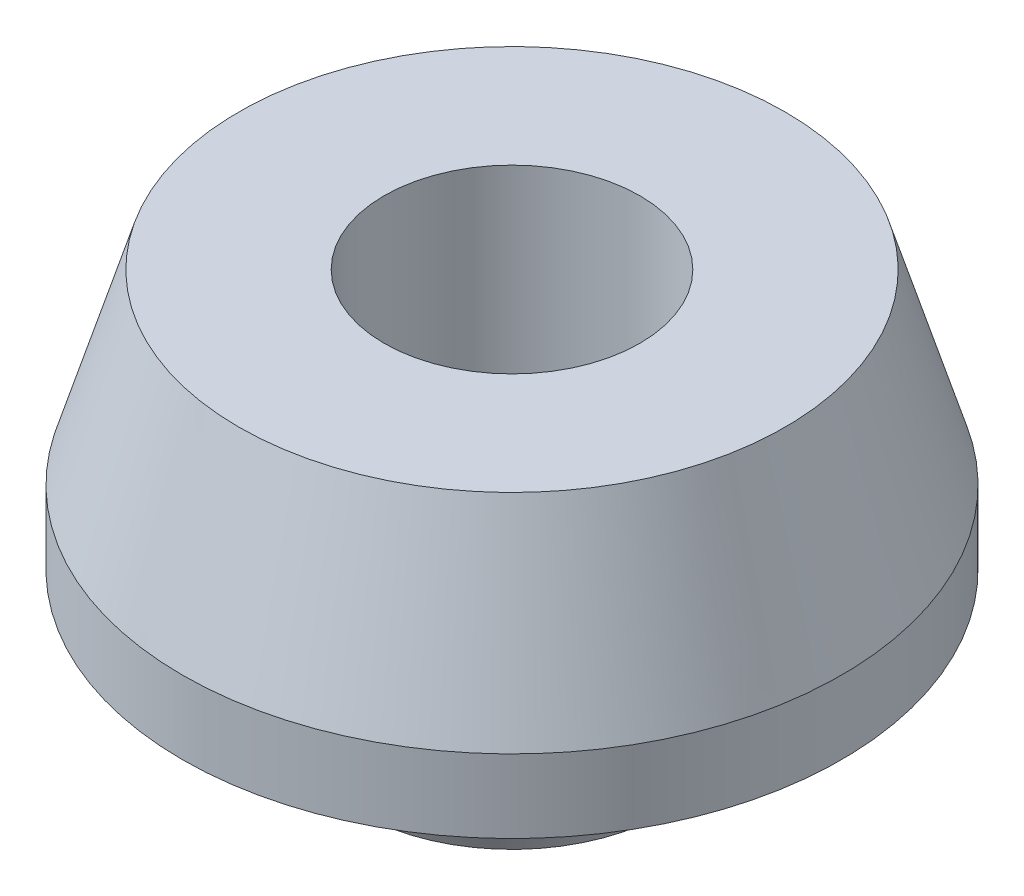
ISO-10303-21;
HEADER;
FILE_DESCRIPTION(('STEP AP214'),'2;1');
FILE_NAME('part.step','',(''),(''),'','','');
FILE_SCHEMA(('AUTOMOTIVE_DESIGN { 1 0 10303 214 1 1 1 1 }'));
ENDSEC;
DATA;
#1=APPLICATION_CONTEXT('core data for automotive mechanical design processes');
#2=APPLICATION_PROTOCOL_DEFINITION('international standard','automotive_design',2000,#1);
#3=PRODUCT_CONTEXT('',#1,'mechanical');
#4=PRODUCT('Part','Part','',(#3));
#5=PRODUCT_RELATED_PRODUCT_CATEGORY('part','',(#4));
#6=PRODUCT_DEFINITION_FORMATION('','',#4);
#7=PRODUCT_DEFINITION_CONTEXT('part definition',#1,'design');
#8=PRODUCT_DEFINITION('design','',#6,#7);
#9=PRODUCT_DEFINITION_SHAPE('','',#8);
#10=(LENGTH_UNIT() NAMED_UNIT(*) SI_UNIT(.MILLI.,.METRE.));
#11=(NAMED_UNIT(*) PLANE_ANGLE_UNIT() SI_UNIT($,.RADIAN.));
#12=(NAMED_UNIT(*) SI_UNIT($,.STERADIAN.) SOLID_ANGLE_UNIT());
#13=UNCERTAINTY_MEASURE_WITH_UNIT(LENGTH_MEASURE(1.E-05),#10,'distance_accuracy_value','');
#14=(GEOMETRIC_REPRESENTATION_CONTEXT(3) GLOBAL_UNCERTAINTY_ASSIGNED_CONTEXT((#13)) GLOBAL_UNIT_ASSIGNED_CONTEXT((#10,
#11,#12)) REPRESENTATION_CONTEXT('',''));
#15=CARTESIAN_POINT('',(0.,0.,0.));
#16=DIRECTION('',(0.,0.,1.));
#17=DIRECTION('',(1.,0.,0.));
#18=AXIS2_PLACEMENT_3D('',#15,#16,#17);
#19=CARTESIAN_POINT('',(0.,17.8514449626196,0.));
#20=DIRECTION('',(0.,1.,0.));
#21=DIRECTION('',(0.,0.,1.));
#22=AXIS2_PLACEMENT_3D('',#19,#20,#21);
#23=CYLINDRICAL_SURFACE('',#22,4.8);
#24=CARTESIAN_POINT('',(0.,0.,0.));
#25=DIRECTION('',(0.,1.,0.));
#26=DIRECTION('',(0.,0.,1.));
#27=AXIS2_PLACEMENT_3D('',#24,#25,#26);
#28=CIRCLE('',#27,4.8);
#29=CARTESIAN_POINT('',(0.,0.,4.8));
#30=VERTEX_POINT('',#29);
#31=EDGE_CURVE('E10',#30,#30,#28,.T.);
#32=ORIENTED_EDGE('',*,*,#31,.F.);
#33=EDGE_LOOP('',(#32));
#34=FACE_BOUND('',#33,.T.);
#35=CARTESIAN_POINT('',(0.,14.75,0.));
#36=DIRECTION('',(0.,1.,0.));
#37=DIRECTION('',(0.,0.,1.));
#38=AXIS2_PLACEMENT_3D('',#35,#36,#37);
#39=CIRCLE('',#38,4.8);
#40=CARTESIAN_POINT('',(0.,14.75,4.8));
#41=VERTEX_POINT('',#40);
#42=EDGE_CURVE('E57',#41,#41,#39,.T.);
#43=ORIENTED_EDGE('',*,*,#42,.T.);
#44=EDGE_LOOP('',(#43));
#45=FACE_BOUND('',#44,.T.);
#46=ADVANCED_FACE('F32',(#34,#45),#23,.F.);
#47=CARTESIAN_POINT('',(4.8,0.,0.));
#48=DIRECTION('',(0.,1.,0.));
#49=DIRECTION('',(0.,0.,1.));
#50=AXIS2_PLACEMENT_3D('',#47,#48,#49);
#51=PLANE('',#50);
#52=CARTESIAN_POINT('',(0.,0.,0.));
#53=DIRECTION('',(0.,1.,0.));
#54=DIRECTION('',(0.,0.,1.));
#55=AXIS2_PLACEMENT_3D('',#52,#53,#54);
#56=CIRCLE('',#55,5.8);
#57=CARTESIAN_POINT('',(0.,0.,5.8));
#58=VERTEX_POINT('',#57);
#59=EDGE_CURVE('E38',#58,#58,#56,.T.);
#60=ORIENTED_EDGE('',*,*,#59,.F.);
#61=EDGE_LOOP('',(#60));
#62=FACE_BOUND('',#61,.T.);
#63=ORIENTED_EDGE('',*,*,#31,.T.);
#64=EDGE_LOOP('',(#63));
#65=FACE_BOUND('',#64,.T.);
#66=ADVANCED_FACE('F88',(#62,#65),#51,.F.);
#67=CARTESIAN_POINT('',(0.,0.,0.));
#68=DIRECTION('',(0.,1.,0.));
#69=DIRECTION('',(0.,0.,1.));
#70=AXIS2_PLACEMENT_3D('',#67,#68,#69);
#71=CONICAL_SURFACE('',#70,5.8,0.349065850398863);
#72=CARTESIAN_POINT('',(0.,5.,0.));
#73=DIRECTION('',(0.,1.,0.));
#74=DIRECTION('',(0.,0.,1.));
#75=AXIS2_PLACEMENT_3D('',#72,#73,#74);
#76=CIRCLE('',#75,7.61985117133099);
#77=CARTESIAN_POINT('',(0.,5.,7.61985117133099));
#78=VERTEX_POINT('',#77);
#79=EDGE_CURVE('E42',#78,#78,#76,.T.);
#80=ORIENTED_EDGE('',*,*,#79,.F.);
#81=EDGE_LOOP('',(#80));
#82=FACE_BOUND('',#81,.T.);
#83=ORIENTED_EDGE('',*,*,#59,.T.);
#84=EDGE_LOOP('',(#83));
#85=FACE_BOUND('',#84,.T.);
#86=ADVANCED_FACE('F83',(#82,#85),#71,.T.);
#87=CARTESIAN_POINT('',(7.61985117133099,5.,0.));
#88=DIRECTION('',(0.,1.,0.));
#89=DIRECTION('',(0.,0.,1.));
#90=AXIS2_PLACEMENT_3D('',#87,#88,#89);
#91=PLANE('',#90);
#92=CARTESIAN_POINT('',(0.,5.,0.));
#93=DIRECTION('',(0.,1.,0.));
#94=DIRECTION('',(0.,0.,1.));
#95=AXIS2_PLACEMENT_3D('',#92,#93,#94);
#96=CIRCLE('',#95,12.369851171331);
#97=CARTESIAN_POINT('',(0.,5.,12.369851171331));
#98=VERTEX_POINT('',#97);
#99=EDGE_CURVE('E46',#98,#98,#96,.T.);
#100=ORIENTED_EDGE('',*,*,#99,.F.);
#101=EDGE_LOOP('',(#100));
#102=FACE_BOUND('',#101,.T.);
#103=ORIENTED_EDGE('',*,*,#79,.T.);
#104=EDGE_LOOP('',(#103));
#105=FACE_BOUND('',#104,.T.);
#106=ADVANCED_FACE('F77',(#102,#105),#91,.F.);
#107=CARTESIAN_POINT('',(0.,17.8514449626196,0.));
#108=DIRECTION('',(0.,1.,0.));
#109=DIRECTION('',(0.,0.,1.));
#110=AXIS2_PLACEMENT_3D('',#107,#108,#109);
#111=CYLINDRICAL_SURFACE('',#110,12.369851171331);
#112=CARTESIAN_POINT('',(0.,7.75,0.));
#113=DIRECTION('',(0.,1.,0.));
#114=DIRECTION('',(0.,0.,1.));
#115=AXIS2_PLACEMENT_3D('',#112,#113,#114);
#116=CIRCLE('',#115,12.369851171331);
#117=CARTESIAN_POINT('',(0.,7.75,12.369851171331));
#118=VERTEX_POINT('',#117);
#119=EDGE_CURVE('E51',#118,#118,#116,.T.);
#120=ORIENTED_EDGE('',*,*,#119,.F.);
#121=EDGE_LOOP('',(#120));
#122=FACE_BOUND('',#121,.T.);
#123=ORIENTED_EDGE('',*,*,#99,.T.);
#124=EDGE_LOOP('',(#123));
#125=FACE_BOUND('',#124,.T.);
#126=ADVANCED_FACE('F71',(#122,#125),#111,.T.);
#127=CARTESIAN_POINT('',(0.,7.75,0.));
#128=DIRECTION('',(0.,-1.,0.));
#129=DIRECTION('',(0.,0.,-1.));
#130=AXIS2_PLACEMENT_3D('',#127,#128,#129);
#131=CONICAL_SURFACE('',#130,12.369851171331,0.294056485766875);
#132=CARTESIAN_POINT('',(0.,14.75,0.));
#133=DIRECTION('',(0.,1.,0.));
#134=DIRECTION('',(0.,0.,1.));
#135=AXIS2_PLACEMENT_3D('',#132,#133,#134);
#136=CIRCLE('',#135,10.25);
#137=CARTESIAN_POINT('',(0.,14.75,10.25));
#138=VERTEX_POINT('',#137);
#139=EDGE_CURVE('E54',#138,#138,#136,.T.);
#140=ORIENTED_EDGE('',*,*,#139,.F.);
#141=EDGE_LOOP('',(#140));
#142=FACE_BOUND('',#141,.T.);
#143=ORIENTED_EDGE('',*,*,#119,.T.);
#144=EDGE_LOOP('',(#143));
#145=FACE_BOUND('',#144,.T.);
#146=ADVANCED_FACE('F65',(#142,#145),#131,.T.);
#147=CARTESIAN_POINT('',(10.25,14.75,0.));
#148=DIRECTION('',(0.,-1.,0.));
#149=DIRECTION('',(0.,0.,-1.));
#150=AXIS2_PLACEMENT_3D('',#147,#148,#149);
#151=PLANE('',#150);
#152=ORIENTED_EDGE('',*,*,#42,.F.);
#153=EDGE_LOOP('',(#152));
#154=FACE_BOUND('',#153,.T.);
#155=ORIENTED_EDGE('',*,*,#139,.T.);
#156=EDGE_LOOP('',(#155));
#157=FACE_BOUND('',#156,.T.);
#158=ADVANCED_FACE('F62',(#154,#157),#151,.F.);
#159=CLOSED_SHELL('',(#46,#66,#86,#106,#126,#146,#158));
#160=MANIFOLD_SOLID_BREP('B2',#159);
#161=ADVANCED_BREP_SHAPE_REPRESENTATION('',(#18,#160),#14);
#162=SHAPE_DEFINITION_REPRESENTATION(#9,#161);
ENDSEC;
END-ISO-10303-21;
